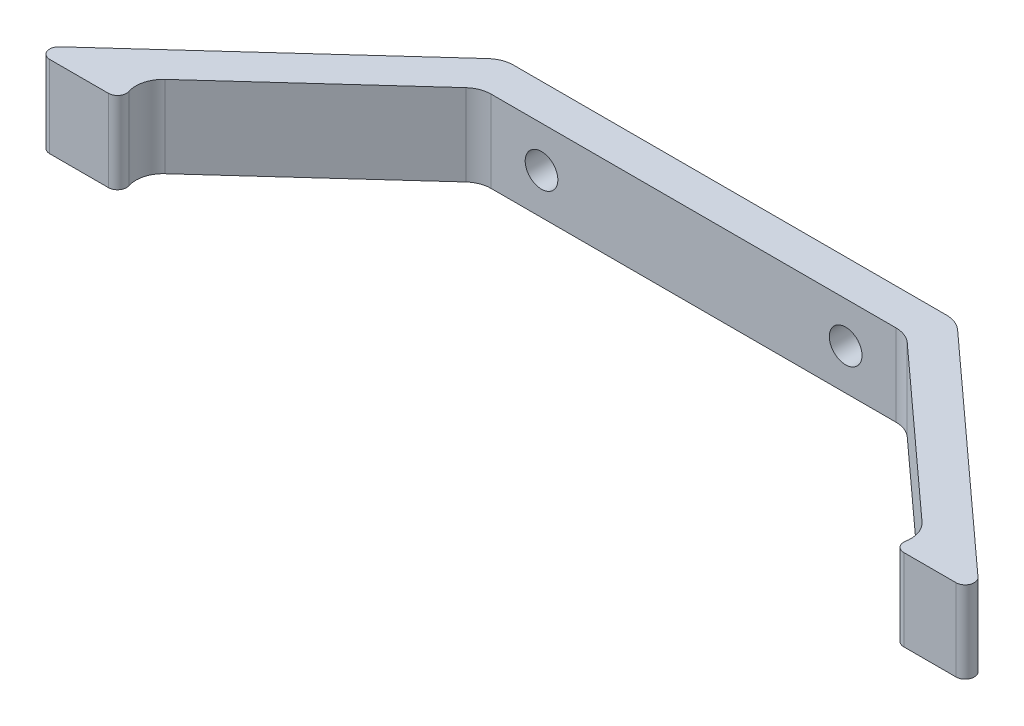
ISO-10303-21;
HEADER;
FILE_DESCRIPTION(('STEP AP214'),'2;1');
FILE_NAME('part.step','',(''),(''),'','','');
FILE_SCHEMA(('AUTOMOTIVE_DESIGN { 1 0 10303 214 1 1 1 1 }'));
ENDSEC;
DATA;
#1=APPLICATION_CONTEXT('core data for automotive mechanical design processes');
#2=APPLICATION_PROTOCOL_DEFINITION('international standard','automotive_design',2000,#1);
#3=PRODUCT_CONTEXT('',#1,'mechanical');
#4=PRODUCT('Part','Part','',(#3));
#5=PRODUCT_RELATED_PRODUCT_CATEGORY('part','',(#4));
#6=PRODUCT_DEFINITION_FORMATION('','',#4);
#7=PRODUCT_DEFINITION_CONTEXT('part definition',#1,'design');
#8=PRODUCT_DEFINITION('design','',#6,#7);
#9=PRODUCT_DEFINITION_SHAPE('','',#8);
#10=(LENGTH_UNIT() NAMED_UNIT(*) SI_UNIT(.MILLI.,.METRE.));
#11=(NAMED_UNIT(*) PLANE_ANGLE_UNIT() SI_UNIT($,.RADIAN.));
#12=(NAMED_UNIT(*) SI_UNIT($,.STERADIAN.) SOLID_ANGLE_UNIT());
#13=UNCERTAINTY_MEASURE_WITH_UNIT(LENGTH_MEASURE(1.E-05),#10,'distance_accuracy_value','');
#14=(GEOMETRIC_REPRESENTATION_CONTEXT(3) GLOBAL_UNCERTAINTY_ASSIGNED_CONTEXT((#13)) GLOBAL_UNIT_ASSIGNED_CONTEXT((#10,
#11,#12)) REPRESENTATION_CONTEXT('',''));
#15=CARTESIAN_POINT('',(0.,0.,0.));
#16=DIRECTION('',(0.,0.,1.));
#17=DIRECTION('',(1.,0.,0.));
#18=AXIS2_PLACEMENT_3D('',#15,#16,#17);
#19=CARTESIAN_POINT('',(25.,9.,-12.5));
#20=DIRECTION('',(0.,0.,1.));
#21=DIRECTION('',(1.,0.,0.));
#22=AXIS2_PLACEMENT_3D('',#19,#20,#21);
#23=PLANE('',#22);
#24=CARTESIAN_POINT('',(-16.75,4.5,-12.5));
#25=DIRECTION('',(0.,0.,1.));
#26=DIRECTION('',(1.,0.,0.));
#27=AXIS2_PLACEMENT_3D('',#24,#25,#26);
#28=CIRCLE('',#27,1.8);
#29=CARTESIAN_POINT('',(-14.95,4.5,-12.5));
#30=VERTEX_POINT('',#29);
#31=EDGE_CURVE('E352',#30,#30,#28,.T.);
#32=ORIENTED_EDGE('',*,*,#31,.T.);
#33=EDGE_LOOP('',(#32));
#34=FACE_BOUND('',#33,.T.);
#35=CARTESIAN_POINT('',(16.75,4.5,-12.5));
#36=DIRECTION('',(0.,0.,1.));
#37=DIRECTION('',(1.,0.,0.));
#38=AXIS2_PLACEMENT_3D('',#35,#36,#37);
#39=CIRCLE('',#38,1.8);
#40=CARTESIAN_POINT('',(18.55,4.5,-12.5));
#41=VERTEX_POINT('',#40);
#42=EDGE_CURVE('E307',#41,#41,#39,.T.);
#43=ORIENTED_EDGE('',*,*,#42,.T.);
#44=EDGE_LOOP('',(#43));
#45=FACE_BOUND('',#44,.T.);
#46=DIRECTION('',(-1.,0.,0.));
#47=VECTOR('',#46,1.);
#48=CARTESIAN_POINT('',(25.,9.,-12.5));
#49=LINE('',#48,#47);
#50=CARTESIAN_POINT('',(23.8401793758045,9.,-12.5));
#51=VERTEX_POINT('',#50);
#52=CARTESIAN_POINT('',(-23.8401793758045,9.,-12.5));
#53=VERTEX_POINT('',#52);
#54=EDGE_CURVE('E186',#51,#53,#49,.T.);
#55=ORIENTED_EDGE('',*,*,#54,.F.);
#56=DIRECTION('',(0.,-1.,0.));
#57=VECTOR('',#56,1.);
#58=CARTESIAN_POINT('',(23.8401793758045,9.,-12.5));
#59=LINE('',#58,#57);
#60=CARTESIAN_POINT('',(23.8401793758045,0.,-12.5));
#61=VERTEX_POINT('',#60);
#62=EDGE_CURVE('E230',#51,#61,#59,.T.);
#63=ORIENTED_EDGE('',*,*,#62,.T.);
#64=DIRECTION('',(-1.,0.,0.));
#65=VECTOR('',#64,1.);
#66=CARTESIAN_POINT('',(25.,0.,-12.5));
#67=LINE('',#66,#65);
#68=CARTESIAN_POINT('',(-23.8401793758045,0.,-12.5));
#69=VERTEX_POINT('',#68);
#70=EDGE_CURVE('E303',#61,#69,#67,.T.);
#71=ORIENTED_EDGE('',*,*,#70,.T.);
#72=DIRECTION('',(0.,-1.,0.));
#73=VECTOR('',#72,1.);
#74=CARTESIAN_POINT('',(-23.8401793758045,9.,-12.5));
#75=LINE('',#74,#73);
#76=EDGE_CURVE('E228',#69,#53,#75,.F.);
#77=ORIENTED_EDGE('',*,*,#76,.T.);
#78=EDGE_LOOP('',(#55,#63,#71,#77));
#79=FACE_BOUND('',#78,.T.);
#80=ADVANCED_FACE('F32',(#34,#45,#79),#23,.F.);
#81=CARTESIAN_POINT('',(-25.,9.,-12.5));
#82=DIRECTION('',(0.672672793996313,0.,0.739940073395943));
#83=DIRECTION('',(0.739940073395944,0.,-0.672672793996313));
#84=AXIS2_PLACEMENT_3D('',#81,#82,#83);
#85=PLANE('',#84);
#86=DIRECTION('',(-0.739940073395944,0.,0.672672793996313));
#87=VECTOR('',#86,1.);
#88=CARTESIAN_POINT('',(-25.,9.,-12.5));
#89=LINE('',#88,#87);
#90=CARTESIAN_POINT('',(-25.8581977577934,9.,-11.7198202201878));
#91=VERTEX_POINT('',#90);
#92=CARTESIAN_POINT('',(-50.5860659192645,9.,10.7600599266041));
#93=VERTEX_POINT('',#92);
#94=EDGE_CURVE('E189',#91,#93,#89,.T.);
#95=ORIENTED_EDGE('',*,*,#94,.F.);
#96=DIRECTION('',(0.,-1.,0.));
#97=VECTOR('',#96,1.);
#98=CARTESIAN_POINT('',(-25.8581977577934,9.,-11.7198202201878));
#99=LINE('',#98,#97);
#100=CARTESIAN_POINT('',(-25.8581977577934,0.,-11.7198202201878));
#101=VERTEX_POINT('',#100);
#102=EDGE_CURVE('E250',#91,#101,#99,.T.);
#103=ORIENTED_EDGE('',*,*,#102,.T.);
#104=DIRECTION('',(-0.739940073395944,0.,0.672672793996313));
#105=VECTOR('',#104,1.);
#106=CARTESIAN_POINT('',(-25.,0.,-12.5));
#107=LINE('',#106,#105);
#108=CARTESIAN_POINT('',(-50.5860659192645,0.,10.7600599266041));
#109=VERTEX_POINT('',#108);
#110=EDGE_CURVE('E306',#101,#109,#107,.T.);
#111=ORIENTED_EDGE('',*,*,#110,.T.);
#112=DIRECTION('',(0.,-1.,0.));
#113=VECTOR('',#112,1.);
#114=CARTESIAN_POINT('',(-50.5860659192644,9.,10.7600599266041));
#115=LINE('',#114,#113);
#116=EDGE_CURVE('E181',#109,#93,#115,.F.);
#117=ORIENTED_EDGE('',*,*,#116,.T.);
#118=EDGE_LOOP('',(#95,#103,#111,#117));
#119=FACE_BOUND('',#118,.T.);
#120=ADVANCED_FACE('F343',(#119),#85,.F.);
#121=CARTESIAN_POINT('',(-52.5,9.,12.5));
#122=DIRECTION('',(0.,0.,-1.));
#123=DIRECTION('',(-1.,0.,0.));
#124=AXIS2_PLACEMENT_3D('',#121,#122,#123);
#125=PLANE('',#124);
#126=DIRECTION('',(1.,0.,0.));
#127=VECTOR('',#126,1.);
#128=CARTESIAN_POINT('',(-52.5,0.,12.5));
#129=LINE('',#128,#127);
#130=CARTESIAN_POINT('',(-49.9133931252681,0.,12.5));
#131=VERTEX_POINT('',#130);
#132=CARTESIAN_POINT('',(-43.454863254184,0.,12.5));
#133=VERTEX_POINT('',#132);
#134=EDGE_CURVE('E309',#131,#133,#129,.T.);
#135=ORIENTED_EDGE('',*,*,#134,.T.);
#136=DIRECTION('',(0.,-1.,0.));
#137=VECTOR('',#136,1.);
#138=CARTESIAN_POINT('',(-43.454863254184,9.,12.5));
#139=LINE('',#138,#137);
#140=CARTESIAN_POINT('',(-43.454863254184,9.,12.5));
#141=VERTEX_POINT('',#140);
#142=EDGE_CURVE('E204',#133,#141,#139,.F.);
#143=ORIENTED_EDGE('',*,*,#142,.T.);
#144=DIRECTION('',(1.,0.,0.));
#145=VECTOR('',#144,1.);
#146=CARTESIAN_POINT('',(-52.5,9.,12.5));
#147=LINE('',#146,#145);
#148=CARTESIAN_POINT('',(-49.9133931252681,9.,12.5));
#149=VERTEX_POINT('',#148);
#150=EDGE_CURVE('E290',#149,#141,#147,.T.);
#151=ORIENTED_EDGE('',*,*,#150,.F.);
#152=DIRECTION('',(0.,-1.,0.));
#153=VECTOR('',#152,1.);
#154=CARTESIAN_POINT('',(-49.9133931252681,9.,12.5));
#155=LINE('',#154,#153);
#156=EDGE_CURVE('E201',#149,#131,#155,.T.);
#157=ORIENTED_EDGE('',*,*,#156,.T.);
#158=EDGE_LOOP('',(#135,#143,#151,#157));
#159=FACE_BOUND('',#158,.T.);
#160=ADVANCED_FACE('F387',(#159),#125,.F.);
#161=CARTESIAN_POINT('',(-43.5019975603943,9.,9.72584096301979));
#162=DIRECTION('',(-0.672672793996313,0.,-0.739940073395944));
#163=DIRECTION('',(-0.739940073395944,0.,0.672672793996313));
#164=AXIS2_PLACEMENT_3D('',#161,#162,#163);
#165=PLANE('',#164);
#166=DIRECTION('',(0.739940073395944,0.,-0.672672793996313));
#167=VECTOR('',#166,1.);
#168=CARTESIAN_POINT('',(-43.5019975603943,0.,9.72584096301979));
#169=LINE('',#168,#167);
#170=CARTESIAN_POINT('',(-41.664894601202,0.,8.05574736375406));
#171=VERTEX_POINT('',#170);
#172=CARTESIAN_POINT('',(-24.311770258866,0.,-7.71982022018782));
#173=VERTEX_POINT('',#172);
#174=EDGE_CURVE('E271',#171,#173,#169,.T.);
#175=ORIENTED_EDGE('',*,*,#174,.T.);
#176=DIRECTION('',(0.,-1.,0.));
#177=VECTOR('',#176,1.);
#178=CARTESIAN_POINT('',(-24.311770258866,9.,-7.71982022018782));
#179=LINE('',#178,#177);
#180=CARTESIAN_POINT('',(-24.311770258866,9.,-7.71982022018782));
#181=VERTEX_POINT('',#180);
#182=EDGE_CURVE('E248',#173,#181,#179,.F.);
#183=ORIENTED_EDGE('',*,*,#182,.T.);
#184=DIRECTION('',(0.739940073395944,0.,-0.672672793996313));
#185=VECTOR('',#184,1.);
#186=CARTESIAN_POINT('',(-43.5019975603943,9.,9.72584096301979));
#187=LINE('',#186,#185);
#188=CARTESIAN_POINT('',(-41.664894601202,9.,8.05574736375406));
#189=VERTEX_POINT('',#188);
#190=EDGE_CURVE('E283',#189,#181,#187,.T.);
#191=ORIENTED_EDGE('',*,*,#190,.F.);
#192=DIRECTION('',(0.,-1.,0.));
#193=VECTOR('',#192,1.);
#194=CARTESIAN_POINT('',(-41.664894601202,9.,8.05574736375406));
#195=LINE('',#194,#193);
#196=EDGE_CURVE('E245',#189,#171,#195,.T.);
#197=ORIENTED_EDGE('',*,*,#196,.T.);
#198=EDGE_LOOP('',(#175,#183,#191,#197));
#199=FACE_BOUND('',#198,.T.);
#200=ADVANCED_FACE('F287',(#199),#165,.F.);
#201=CARTESIAN_POINT('',(-23.4535725010726,9.,-8.49999999999998));
#202=DIRECTION('',(0.,0.,-1.));
#203=DIRECTION('',(-1.,0.,0.));
#204=AXIS2_PLACEMENT_3D('',#201,#202,#203);
#205=PLANE('',#204);
#206=CARTESIAN_POINT('',(-16.75,4.5,-8.49999999999998));
#207=DIRECTION('',(0.,0.,1.));
#208=DIRECTION('',(1.,0.,0.));
#209=AXIS2_PLACEMENT_3D('',#206,#207,#208);
#210=CIRCLE('',#209,1.79999999999999);
#211=CARTESIAN_POINT('',(-14.95,4.5,-8.49999999999998));
#212=VERTEX_POINT('',#211);
#213=EDGE_CURVE('E355',#212,#212,#210,.T.);
#214=ORIENTED_EDGE('',*,*,#213,.F.);
#215=EDGE_LOOP('',(#214));
#216=FACE_BOUND('',#215,.T.);
#217=CARTESIAN_POINT('',(16.75,4.5,-8.49999999999998));
#218=DIRECTION('',(0.,0.,1.));
#219=DIRECTION('',(1.,0.,0.));
#220=AXIS2_PLACEMENT_3D('',#217,#218,#219);
#221=CIRCLE('',#220,1.79999999999999);
#222=CARTESIAN_POINT('',(18.55,4.5,-8.49999999999998));
#223=VERTEX_POINT('',#222);
#224=EDGE_CURVE('E349',#223,#223,#221,.T.);
#225=ORIENTED_EDGE('',*,*,#224,.F.);
#226=EDGE_LOOP('',(#225));
#227=FACE_BOUND('',#226,.T.);
#228=DIRECTION('',(1.,0.,0.));
#229=VECTOR('',#228,1.);
#230=CARTESIAN_POINT('',(-23.4535725010726,0.,-8.49999999999998));
#231=LINE('',#230,#229);
#232=CARTESIAN_POINT('',(-22.293751876877,0.,-8.49999999999998));
#233=VERTEX_POINT('',#232);
#234=CARTESIAN_POINT('',(22.293751876877,0.,-8.49999999999998));
#235=VERTEX_POINT('',#234);
#236=EDGE_CURVE('E312',#233,#235,#231,.T.);
#237=ORIENTED_EDGE('',*,*,#236,.T.);
#238=DIRECTION('',(0.,-1.,0.));
#239=VECTOR('',#238,1.);
#240=CARTESIAN_POINT('',(22.293751876877,9.,-8.49999999999998));
#241=LINE('',#240,#239);
#242=CARTESIAN_POINT('',(22.293751876877,9.,-8.49999999999998));
#243=VERTEX_POINT('',#242);
#244=EDGE_CURVE('E55',#235,#243,#241,.F.);
#245=ORIENTED_EDGE('',*,*,#244,.T.);
#246=DIRECTION('',(1.,0.,0.));
#247=VECTOR('',#246,1.);
#248=CARTESIAN_POINT('',(-23.4535725010726,9.,-8.49999999999998));
#249=LINE('',#248,#247);
#250=CARTESIAN_POINT('',(-22.293751876877,9.,-8.49999999999998));
#251=VERTEX_POINT('',#250);
#252=EDGE_CURVE('E289',#251,#243,#249,.T.);
#253=ORIENTED_EDGE('',*,*,#252,.F.);
#254=DIRECTION('',(0.,-1.,0.));
#255=VECTOR('',#254,1.);
#256=CARTESIAN_POINT('',(-22.293751876877,0.,-8.49999999999998));
#257=LINE('',#256,#255);
#258=EDGE_CURVE('E241',#251,#233,#257,.T.);
#259=ORIENTED_EDGE('',*,*,#258,.T.);
#260=EDGE_LOOP('',(#237,#245,#253,#259));
#261=FACE_BOUND('',#260,.T.);
#262=ADVANCED_FACE('F361',(#216,#227,#261),#205,.F.);
#263=CARTESIAN_POINT('',(23.4535725010726,9.,-8.49999999999998));
#264=DIRECTION('',(0.672672793996312,0.,-0.739940073395944));
#265=DIRECTION('',(-0.739940073395944,0.,-0.672672793996312));
#266=AXIS2_PLACEMENT_3D('',#263,#264,#265);
#267=PLANE('',#266);
#268=DIRECTION('',(0.739940073395944,0.,0.672672793996312));
#269=VECTOR('',#268,1.);
#270=CARTESIAN_POINT('',(23.4535725010726,0.,-8.49999999999998));
#271=LINE('',#270,#269);
#272=CARTESIAN_POINT('',(24.311770258866,0.,-7.71982022018782));
#273=VERTEX_POINT('',#272);
#274=CARTESIAN_POINT('',(42.2362375395269,0.,8.57515003495843));
#275=VERTEX_POINT('',#274);
#276=EDGE_CURVE('E191',#273,#275,#271,.T.);
#277=ORIENTED_EDGE('',*,*,#276,.T.);
#278=DIRECTION('',(0.,-1.,0.));
#279=VECTOR('',#278,1.);
#280=CARTESIAN_POINT('',(42.2362375395269,9.,8.57515003495844));
#281=LINE('',#280,#279);
#282=CARTESIAN_POINT('',(42.2362375395269,9.,8.57515003495843));
#283=VERTEX_POINT('',#282);
#284=EDGE_CURVE('E226',#275,#283,#281,.F.);
#285=ORIENTED_EDGE('',*,*,#284,.T.);
#286=DIRECTION('',(0.739940073395944,0.,0.672672793996312));
#287=VECTOR('',#286,1.);
#288=CARTESIAN_POINT('',(23.4535725010726,9.,-8.49999999999998));
#289=LINE('',#288,#287);
#290=CARTESIAN_POINT('',(24.311770258866,9.,-7.71982022018782));
#291=VERTEX_POINT('',#290);
#292=EDGE_CURVE('E292',#291,#283,#289,.T.);
#293=ORIENTED_EDGE('',*,*,#292,.F.);
#294=DIRECTION('',(0.,-1.,0.));
#295=VECTOR('',#294,1.);
#296=CARTESIAN_POINT('',(24.311770258866,0.,-7.71982022018782));
#297=LINE('',#296,#295);
#298=EDGE_CURVE('E223',#291,#273,#297,.T.);
#299=ORIENTED_EDGE('',*,*,#298,.T.);
#300=EDGE_LOOP('',(#277,#285,#293,#299));
#301=FACE_BOUND('',#300,.T.);
#302=ADVANCED_FACE('F317',(#301),#267,.F.);
#303=CARTESIAN_POINT('',(41.5,9.,12.5));
#304=DIRECTION('',(0.,0.,-1.));
#305=DIRECTION('',(-1.,0.,0.));
#306=AXIS2_PLACEMENT_3D('',#303,#304,#305);
#307=PLANE('',#306);
#308=DIRECTION('',(1.,0.,0.));
#309=VECTOR('',#308,1.);
#310=CARTESIAN_POINT('',(41.5,0.,12.5));
#311=LINE('',#310,#309);
#312=CARTESIAN_POINT('',(44.1555955757727,0.,12.5));
#313=VERTEX_POINT('',#312);
#314=CARTESIAN_POINT('',(49.9133931252682,0.,12.5));
#315=VERTEX_POINT('',#314);
#316=EDGE_CURVE('E187',#313,#315,#311,.T.);
#317=ORIENTED_EDGE('',*,*,#316,.T.);
#318=DIRECTION('',(0.,-1.,0.));
#319=VECTOR('',#318,1.);
#320=CARTESIAN_POINT('',(49.9133931252682,9.,12.5));
#321=LINE('',#320,#319);
#322=CARTESIAN_POINT('',(49.9133931252682,9.,12.5));
#323=VERTEX_POINT('',#322);
#324=EDGE_CURVE('E164',#315,#323,#321,.F.);
#325=ORIENTED_EDGE('',*,*,#324,.T.);
#326=DIRECTION('',(1.,0.,0.));
#327=VECTOR('',#326,1.);
#328=CARTESIAN_POINT('',(41.5,9.,12.5));
#329=LINE('',#328,#327);
#330=CARTESIAN_POINT('',(44.1555955757727,9.,12.5));
#331=VERTEX_POINT('',#330);
#332=EDGE_CURVE('E299',#331,#323,#329,.T.);
#333=ORIENTED_EDGE('',*,*,#332,.F.);
#334=DIRECTION('',(0.,-1.,0.));
#335=VECTOR('',#334,1.);
#336=CARTESIAN_POINT('',(44.1555955757727,9.,12.5));
#337=LINE('',#336,#335);
#338=EDGE_CURVE('E180',#331,#313,#337,.T.);
#339=ORIENTED_EDGE('',*,*,#338,.T.);
#340=EDGE_LOOP('',(#317,#325,#333,#339));
#341=FACE_BOUND('',#340,.T.);
#342=ADVANCED_FACE('F330',(#341),#307,.F.);
#343=CARTESIAN_POINT('',(52.5,9.,12.5));
#344=DIRECTION('',(-0.672672793996312,0.,0.739940073395944));
#345=DIRECTION('',(0.739940073395944,0.,0.672672793996312));
#346=AXIS2_PLACEMENT_3D('',#343,#344,#345);
#347=PLANE('',#346);
#348=DIRECTION('',(-0.739940073395944,0.,-0.672672793996312));
#349=VECTOR('',#348,1.);
#350=CARTESIAN_POINT('',(52.5,0.,12.5));
#351=LINE('',#350,#349);
#352=CARTESIAN_POINT('',(50.5860659192645,0.,10.7600599266041));
#353=VERTEX_POINT('',#352);
#354=CARTESIAN_POINT('',(25.8581977577934,0.,-11.7198202201878));
#355=VERTEX_POINT('',#354);
#356=EDGE_CURVE('E176',#353,#355,#351,.T.);
#357=ORIENTED_EDGE('',*,*,#356,.T.);
#358=DIRECTION('',(0.,-1.,0.));
#359=VECTOR('',#358,1.);
#360=CARTESIAN_POINT('',(25.8581977577934,9.,-11.7198202201878));
#361=LINE('',#360,#359);
#362=CARTESIAN_POINT('',(25.8581977577934,9.,-11.7198202201878));
#363=VERTEX_POINT('',#362);
#364=EDGE_CURVE('E236',#355,#363,#361,.F.);
#365=ORIENTED_EDGE('',*,*,#364,.T.);
#366=DIRECTION('',(-0.739940073395944,0.,-0.672672793996312));
#367=VECTOR('',#366,1.);
#368=CARTESIAN_POINT('',(52.5,9.,12.5));
#369=LINE('',#368,#367);
#370=CARTESIAN_POINT('',(50.5860659192645,9.,10.7600599266041));
#371=VERTEX_POINT('',#370);
#372=EDGE_CURVE('E179',#371,#363,#369,.T.);
#373=ORIENTED_EDGE('',*,*,#372,.F.);
#374=DIRECTION('',(0.,-1.,0.));
#375=VECTOR('',#374,1.);
#376=CARTESIAN_POINT('',(50.5860659192645,9.,10.7600599266041));
#377=LINE('',#376,#375);
#378=EDGE_CURVE('E163',#371,#353,#377,.T.);
#379=ORIENTED_EDGE('',*,*,#378,.T.);
#380=EDGE_LOOP('',(#357,#365,#373,#379));
#381=FACE_BOUND('',#380,.T.);
#382=ADVANCED_FACE('F175',(#381),#347,.F.);
#383=CARTESIAN_POINT('',(0.,9.,0.));
#384=DIRECTION('',(0.,-1.,0.));
#385=DIRECTION('',(0.,0.,-1.));
#386=AXIS2_PLACEMENT_3D('',#383,#384,#385);
#387=PLANE('',#386);
#388=ORIENTED_EDGE('',*,*,#372,.T.);
#389=CARTESIAN_POINT('',(23.8401793758045,9.,-9.49999999999999));
#390=DIRECTION('',(0.,-1.,0.));
#391=DIRECTION('',(0.,0.,-1.));
#392=AXIS2_PLACEMENT_3D('',#389,#390,#391);
#393=CIRCLE('',#392,3.);
#394=EDGE_CURVE('E239',#363,#51,#393,.F.);
#395=ORIENTED_EDGE('',*,*,#394,.T.);
#396=ORIENTED_EDGE('',*,*,#54,.T.);
#397=CARTESIAN_POINT('',(-23.8401793758045,9.,-9.49999999999999));
#398=DIRECTION('',(0.,-1.,0.));
#399=DIRECTION('',(0.,0.,-1.));
#400=AXIS2_PLACEMENT_3D('',#397,#398,#399);
#401=CIRCLE('',#400,3.);
#402=EDGE_CURVE('E47',#53,#91,#401,.F.);
#403=ORIENTED_EDGE('',*,*,#402,.T.);
#404=ORIENTED_EDGE('',*,*,#94,.T.);
#405=CARTESIAN_POINT('',(-49.9133931252681,9.,11.5));
#406=DIRECTION('',(0.,-1.,0.));
#407=DIRECTION('',(0.,0.,-1.));
#408=AXIS2_PLACEMENT_3D('',#405,#406,#407);
#409=CIRCLE('',#408,1.);
#410=EDGE_CURVE('E210',#93,#149,#409,.F.);
#411=ORIENTED_EDGE('',*,*,#410,.T.);
#412=ORIENTED_EDGE('',*,*,#150,.T.);
#413=CARTESIAN_POINT('',(-43.454863254184,9.,11.5));
#414=DIRECTION('',(0.,-1.,0.));
#415=DIRECTION('',(0.,0.,-1.));
#416=AXIS2_PLACEMENT_3D('',#413,#414,#415);
#417=CIRCLE('',#416,1.);
#418=CARTESIAN_POINT('',(-42.5028664954412,9.,11.1938918959855));
#419=VERTEX_POINT('',#418);
#420=EDGE_CURVE('E212',#141,#419,#417,.F.);
#421=ORIENTED_EDGE('',*,*,#420,.T.);
#422=CARTESIAN_POINT('',(-39.6468762192131,9.,10.2755675839419));
#423=DIRECTION('',(0.,-1.,0.));
#424=DIRECTION('',(0.,0.,-1.));
#425=AXIS2_PLACEMENT_3D('',#422,#423,#424);
#426=CIRCLE('',#425,3.);
#427=EDGE_CURVE('E11',#419,#189,#426,.T.);
#428=ORIENTED_EDGE('',*,*,#427,.T.);
#429=ORIENTED_EDGE('',*,*,#190,.T.);
#430=CARTESIAN_POINT('',(-22.293751876877,9.,-5.49999999999998));
#431=DIRECTION('',(0.,-1.,0.));
#432=DIRECTION('',(0.,0.,-1.));
#433=AXIS2_PLACEMENT_3D('',#430,#431,#432);
#434=CIRCLE('',#433,3.);
#435=EDGE_CURVE('E265',#181,#251,#434,.T.);
#436=ORIENTED_EDGE('',*,*,#435,.T.);
#437=ORIENTED_EDGE('',*,*,#252,.T.);
#438=CARTESIAN_POINT('',(22.293751876877,9.,-5.49999999999998));
#439=DIRECTION('',(0.,-1.,0.));
#440=DIRECTION('',(0.,0.,-1.));
#441=AXIS2_PLACEMENT_3D('',#438,#439,#440);
#442=CIRCLE('',#441,3.);
#443=EDGE_CURVE('E261',#243,#291,#442,.T.);
#444=ORIENTED_EDGE('',*,*,#443,.T.);
#445=ORIENTED_EDGE('',*,*,#292,.T.);
#446=CARTESIAN_POINT('',(40.2182191575379,9.,10.7949702551463));
#447=DIRECTION('',(0.,-1.,0.));
#448=DIRECTION('',(0.,0.,-1.));
#449=AXIS2_PLACEMENT_3D('',#446,#447,#448);
#450=CIRCLE('',#449,3.);
#451=CARTESIAN_POINT('',(43.171251471214,9.,11.3237425637866));
#452=VERTEX_POINT('',#451);
#453=EDGE_CURVE('E257',#283,#452,#450,.T.);
#454=ORIENTED_EDGE('',*,*,#453,.T.);
#455=CARTESIAN_POINT('',(44.1555955757727,9.,11.5));
#456=DIRECTION('',(0.,-1.,0.));
#457=DIRECTION('',(0.,0.,-1.));
#458=AXIS2_PLACEMENT_3D('',#455,#456,#457);
#459=CIRCLE('',#458,1.);
#460=EDGE_CURVE('E206',#452,#331,#459,.F.);
#461=ORIENTED_EDGE('',*,*,#460,.T.);
#462=ORIENTED_EDGE('',*,*,#332,.T.);
#463=CARTESIAN_POINT('',(49.9133931252682,9.,11.5));
#464=DIRECTION('',(0.,-1.,0.));
#465=DIRECTION('',(0.,0.,-1.));
#466=AXIS2_PLACEMENT_3D('',#463,#464,#465);
#467=CIRCLE('',#466,1.);
#468=EDGE_CURVE('E208',#323,#371,#467,.F.);
#469=ORIENTED_EDGE('',*,*,#468,.T.);
#470=EDGE_LOOP('',(#388,#395,#396,#403,#404,#411,#412,#421,#428,#429,#436,#437,#444,#445,#454,
#461,#462,#469));
#471=FACE_BOUND('',#470,.T.);
#472=ADVANCED_FACE('F282',(#471),#387,.F.);
#473=CARTESIAN_POINT('',(0.,0.,0.));
#474=DIRECTION('',(0.,-1.,0.));
#475=DIRECTION('',(0.,0.,-1.));
#476=AXIS2_PLACEMENT_3D('',#473,#474,#475);
#477=PLANE('',#476);
#478=ORIENTED_EDGE('',*,*,#70,.F.);
#479=CARTESIAN_POINT('',(23.8401793758045,0.,-9.49999999999999));
#480=DIRECTION('',(0.,-1.,0.));
#481=DIRECTION('',(0.,0.,-1.));
#482=AXIS2_PLACEMENT_3D('',#479,#480,#481);
#483=CIRCLE('',#482,3.);
#484=EDGE_CURVE('E185',#61,#355,#483,.T.);
#485=ORIENTED_EDGE('',*,*,#484,.T.);
#486=ORIENTED_EDGE('',*,*,#356,.F.);
#487=CARTESIAN_POINT('',(49.9133931252682,0.,11.5));
#488=DIRECTION('',(0.,-1.,0.));
#489=DIRECTION('',(0.,0.,-1.));
#490=AXIS2_PLACEMENT_3D('',#487,#488,#489);
#491=CIRCLE('',#490,1.);
#492=EDGE_CURVE('E159',#353,#315,#491,.T.);
#493=ORIENTED_EDGE('',*,*,#492,.T.);
#494=ORIENTED_EDGE('',*,*,#316,.F.);
#495=CARTESIAN_POINT('',(44.1555955757727,0.,11.5));
#496=DIRECTION('',(0.,-1.,0.));
#497=DIRECTION('',(0.,0.,-1.));
#498=AXIS2_PLACEMENT_3D('',#495,#496,#497);
#499=CIRCLE('',#498,1.);
#500=CARTESIAN_POINT('',(43.171251471214,0.,11.3237425637866));
#501=VERTEX_POINT('',#500);
#502=EDGE_CURVE('E170',#313,#501,#499,.T.);
#503=ORIENTED_EDGE('',*,*,#502,.T.);
#504=CARTESIAN_POINT('',(40.2182191575379,0.,10.7949702551463));
#505=DIRECTION('',(0.,-1.,0.));
#506=DIRECTION('',(0.,0.,-1.));
#507=AXIS2_PLACEMENT_3D('',#504,#505,#506);
#508=CIRCLE('',#507,3.);
#509=EDGE_CURVE('E255',#501,#275,#508,.F.);
#510=ORIENTED_EDGE('',*,*,#509,.T.);
#511=ORIENTED_EDGE('',*,*,#276,.F.);
#512=CARTESIAN_POINT('',(22.293751876877,0.,-5.49999999999998));
#513=DIRECTION('',(0.,-1.,0.));
#514=DIRECTION('',(0.,0.,-1.));
#515=AXIS2_PLACEMENT_3D('',#512,#513,#514);
#516=CIRCLE('',#515,3.);
#517=EDGE_CURVE('E259',#273,#235,#516,.F.);
#518=ORIENTED_EDGE('',*,*,#517,.T.);
#519=ORIENTED_EDGE('',*,*,#236,.F.);
#520=CARTESIAN_POINT('',(-22.293751876877,0.,-5.49999999999998));
#521=DIRECTION('',(0.,-1.,0.));
#522=DIRECTION('',(0.,0.,-1.));
#523=AXIS2_PLACEMENT_3D('',#520,#521,#522);
#524=CIRCLE('',#523,3.);
#525=EDGE_CURVE('E263',#233,#173,#524,.F.);
#526=ORIENTED_EDGE('',*,*,#525,.T.);
#527=ORIENTED_EDGE('',*,*,#174,.F.);
#528=CARTESIAN_POINT('',(-39.6468762192131,0.,10.2755675839419));
#529=DIRECTION('',(0.,-1.,0.));
#530=DIRECTION('',(0.,0.,-1.));
#531=AXIS2_PLACEMENT_3D('',#528,#529,#530);
#532=CIRCLE('',#531,3.);
#533=CARTESIAN_POINT('',(-42.5028664954412,0.,11.1938918959855));
#534=VERTEX_POINT('',#533);
#535=EDGE_CURVE('E40',#171,#534,#532,.F.);
#536=ORIENTED_EDGE('',*,*,#535,.T.);
#537=CARTESIAN_POINT('',(-43.454863254184,0.,11.5));
#538=DIRECTION('',(0.,-1.,0.));
#539=DIRECTION('',(0.,0.,-1.));
#540=AXIS2_PLACEMENT_3D('',#537,#538,#539);
#541=CIRCLE('',#540,1.);
#542=EDGE_CURVE('E199',#534,#133,#541,.T.);
#543=ORIENTED_EDGE('',*,*,#542,.T.);
#544=ORIENTED_EDGE('',*,*,#134,.F.);
#545=CARTESIAN_POINT('',(-49.9133931252681,0.,11.5));
#546=DIRECTION('',(0.,-1.,0.));
#547=DIRECTION('',(0.,0.,-1.));
#548=AXIS2_PLACEMENT_3D('',#545,#546,#547);
#549=CIRCLE('',#548,1.);
#550=EDGE_CURVE('E169',#131,#109,#549,.T.);
#551=ORIENTED_EDGE('',*,*,#550,.T.);
#552=ORIENTED_EDGE('',*,*,#110,.F.);
#553=CARTESIAN_POINT('',(-23.8401793758045,0.,-9.49999999999999));
#554=DIRECTION('',(0.,-1.,0.));
#555=DIRECTION('',(0.,0.,-1.));
#556=AXIS2_PLACEMENT_3D('',#553,#554,#555);
#557=CIRCLE('',#556,3.);
#558=EDGE_CURVE('E233',#101,#69,#557,.T.);
#559=ORIENTED_EDGE('',*,*,#558,.T.);
#560=EDGE_LOOP('',(#478,#485,#486,#493,#494,#503,#510,#511,#518,#519,#526,#527,#536,#543,#544,
#551,#552,#559));
#561=FACE_BOUND('',#560,.T.);
#562=ADVANCED_FACE('F184',(#561),#477,.T.);
#563=CARTESIAN_POINT('',(-43.454863254184,9.,11.5));
#564=DIRECTION('',(0.,-1.,0.));
#565=DIRECTION('',(0.,0.,-1.));
#566=AXIS2_PLACEMENT_3D('',#563,#564,#565);
#567=CYLINDRICAL_SURFACE('',#566,1.);
#568=ORIENTED_EDGE('',*,*,#542,.F.);
#569=DIRECTION('',(0.,-1.,0.));
#570=VECTOR('',#569,1.);
#571=CARTESIAN_POINT('',(-42.5028664954412,9.,11.1938918959855));
#572=LINE('',#571,#570);
#573=EDGE_CURVE('E253',#534,#419,#572,.F.);
#574=ORIENTED_EDGE('',*,*,#573,.T.);
#575=ORIENTED_EDGE('',*,*,#420,.F.);
#576=ORIENTED_EDGE('',*,*,#142,.F.);
#577=EDGE_LOOP('',(#568,#574,#575,#576));
#578=FACE_BOUND('',#577,.T.);
#579=ADVANCED_FACE('F277',(#578),#567,.T.);
#580=CARTESIAN_POINT('',(-49.9133931252681,9.,11.5));
#581=DIRECTION('',(0.,-1.,0.));
#582=DIRECTION('',(0.,0.,-1.));
#583=AXIS2_PLACEMENT_3D('',#580,#581,#582);
#584=CYLINDRICAL_SURFACE('',#583,1.);
#585=ORIENTED_EDGE('',*,*,#410,.F.);
#586=ORIENTED_EDGE('',*,*,#116,.F.);
#587=ORIENTED_EDGE('',*,*,#550,.F.);
#588=ORIENTED_EDGE('',*,*,#156,.F.);
#589=EDGE_LOOP('',(#585,#586,#587,#588));
#590=FACE_BOUND('',#589,.T.);
#591=ADVANCED_FACE('F394',(#590),#584,.T.);
#592=CARTESIAN_POINT('',(49.9133931252682,9.,11.5));
#593=DIRECTION('',(0.,-1.,0.));
#594=DIRECTION('',(0.,0.,-1.));
#595=AXIS2_PLACEMENT_3D('',#592,#593,#594);
#596=CYLINDRICAL_SURFACE('',#595,1.);
#597=ORIENTED_EDGE('',*,*,#468,.F.);
#598=ORIENTED_EDGE('',*,*,#324,.F.);
#599=ORIENTED_EDGE('',*,*,#492,.F.);
#600=ORIENTED_EDGE('',*,*,#378,.F.);
#601=EDGE_LOOP('',(#597,#598,#599,#600));
#602=FACE_BOUND('',#601,.T.);
#603=ADVANCED_FACE('F162',(#602),#596,.T.);
#604=CARTESIAN_POINT('',(44.1555955757727,9.,11.5));
#605=DIRECTION('',(0.,-1.,0.));
#606=DIRECTION('',(0.,0.,-1.));
#607=AXIS2_PLACEMENT_3D('',#604,#605,#606);
#608=CYLINDRICAL_SURFACE('',#607,1.);
#609=ORIENTED_EDGE('',*,*,#460,.F.);
#610=DIRECTION('',(0.,-1.,0.));
#611=VECTOR('',#610,1.);
#612=CARTESIAN_POINT('',(43.171251471214,9.,11.3237425637866));
#613=LINE('',#612,#611);
#614=EDGE_CURVE('E220',#452,#501,#613,.T.);
#615=ORIENTED_EDGE('',*,*,#614,.T.);
#616=ORIENTED_EDGE('',*,*,#502,.F.);
#617=ORIENTED_EDGE('',*,*,#338,.F.);
#618=EDGE_LOOP('',(#609,#615,#616,#617));
#619=FACE_BOUND('',#618,.T.);
#620=ADVANCED_FACE('F328',(#619),#608,.T.);
#621=CARTESIAN_POINT('',(40.2182191575379,9.,10.7949702551463));
#622=DIRECTION('',(0.,-1.,0.));
#623=DIRECTION('',(0.,0.,-1.));
#624=AXIS2_PLACEMENT_3D('',#621,#622,#623);
#625=CYLINDRICAL_SURFACE('',#624,3.);
#626=ORIENTED_EDGE('',*,*,#453,.F.);
#627=ORIENTED_EDGE('',*,*,#284,.F.);
#628=ORIENTED_EDGE('',*,*,#509,.F.);
#629=ORIENTED_EDGE('',*,*,#614,.F.);
#630=EDGE_LOOP('',(#626,#627,#628,#629));
#631=FACE_BOUND('',#630,.T.);
#632=ADVANCED_FACE('F322',(#631),#625,.F.);
#633=CARTESIAN_POINT('',(23.8401793758045,9.,-9.49999999999999));
#634=DIRECTION('',(0.,-1.,0.));
#635=DIRECTION('',(0.,0.,-1.));
#636=AXIS2_PLACEMENT_3D('',#633,#634,#635);
#637=CYLINDRICAL_SURFACE('',#636,3.);
#638=ORIENTED_EDGE('',*,*,#394,.F.);
#639=ORIENTED_EDGE('',*,*,#364,.F.);
#640=ORIENTED_EDGE('',*,*,#484,.F.);
#641=ORIENTED_EDGE('',*,*,#62,.F.);
#642=EDGE_LOOP('',(#638,#639,#640,#641));
#643=FACE_BOUND('',#642,.T.);
#644=ADVANCED_FACE('F335',(#643),#637,.T.);
#645=CARTESIAN_POINT('',(22.293751876877,9.,-5.49999999999998));
#646=DIRECTION('',(0.,1.,0.));
#647=DIRECTION('',(0.,0.,1.));
#648=AXIS2_PLACEMENT_3D('',#645,#646,#647);
#649=CYLINDRICAL_SURFACE('',#648,3.);
#650=ORIENTED_EDGE('',*,*,#443,.F.);
#651=ORIENTED_EDGE('',*,*,#244,.F.);
#652=ORIENTED_EDGE('',*,*,#517,.F.);
#653=ORIENTED_EDGE('',*,*,#298,.F.);
#654=EDGE_LOOP('',(#650,#651,#652,#653));
#655=FACE_BOUND('',#654,.T.);
#656=ADVANCED_FACE('F370',(#655),#649,.F.);
#657=CARTESIAN_POINT('',(-22.293751876877,9.,-5.49999999999998));
#658=DIRECTION('',(0.,1.,0.));
#659=DIRECTION('',(0.,0.,1.));
#660=AXIS2_PLACEMENT_3D('',#657,#658,#659);
#661=CYLINDRICAL_SURFACE('',#660,3.);
#662=ORIENTED_EDGE('',*,*,#435,.F.);
#663=ORIENTED_EDGE('',*,*,#182,.F.);
#664=ORIENTED_EDGE('',*,*,#525,.F.);
#665=ORIENTED_EDGE('',*,*,#258,.F.);
#666=EDGE_LOOP('',(#662,#663,#664,#665));
#667=FACE_BOUND('',#666,.T.);
#668=ADVANCED_FACE('F372',(#667),#661,.F.);
#669=CARTESIAN_POINT('',(-23.8401793758045,9.,-9.49999999999999));
#670=DIRECTION('',(0.,-1.,0.));
#671=DIRECTION('',(0.,0.,-1.));
#672=AXIS2_PLACEMENT_3D('',#669,#670,#671);
#673=CYLINDRICAL_SURFACE('',#672,3.);
#674=ORIENTED_EDGE('',*,*,#402,.F.);
#675=ORIENTED_EDGE('',*,*,#76,.F.);
#676=ORIENTED_EDGE('',*,*,#558,.F.);
#677=ORIENTED_EDGE('',*,*,#102,.F.);
#678=EDGE_LOOP('',(#674,#675,#676,#677));
#679=FACE_BOUND('',#678,.T.);
#680=ADVANCED_FACE('F341',(#679),#673,.T.);
#681=CARTESIAN_POINT('',(-39.6468762192131,9.,10.2755675839419));
#682=DIRECTION('',(0.,-1.,0.));
#683=DIRECTION('',(0.,0.,-1.));
#684=AXIS2_PLACEMENT_3D('',#681,#682,#683);
#685=CYLINDRICAL_SURFACE('',#684,3.);
#686=ORIENTED_EDGE('',*,*,#427,.F.);
#687=ORIENTED_EDGE('',*,*,#573,.F.);
#688=ORIENTED_EDGE('',*,*,#535,.F.);
#689=ORIENTED_EDGE('',*,*,#196,.F.);
#690=EDGE_LOOP('',(#686,#687,#688,#689));
#691=FACE_BOUND('',#690,.T.);
#692=ADVANCED_FACE('F34',(#691),#685,.F.);
#693=CARTESIAN_POINT('',(16.75,4.5,-8.49999999999998));
#694=DIRECTION('',(0.,0.,1.));
#695=DIRECTION('',(1.,0.,0.));
#696=AXIS2_PLACEMENT_3D('',#693,#694,#695);
#697=CYLINDRICAL_SURFACE('',#696,1.79999999999999);
#698=ORIENTED_EDGE('',*,*,#42,.F.);
#699=EDGE_LOOP('',(#698));
#700=FACE_BOUND('',#699,.T.);
#701=ORIENTED_EDGE('',*,*,#224,.T.);
#702=EDGE_LOOP('',(#701));
#703=FACE_BOUND('',#702,.T.);
#704=ADVANCED_FACE('F430',(#700,#703),#697,.F.);
#705=CARTESIAN_POINT('',(-16.75,4.5,-8.49999999999998));
#706=DIRECTION('',(0.,0.,1.));
#707=DIRECTION('',(1.,0.,0.));
#708=AXIS2_PLACEMENT_3D('',#705,#706,#707);
#709=CYLINDRICAL_SURFACE('',#708,1.79999999999999);
#710=ORIENTED_EDGE('',*,*,#31,.F.);
#711=EDGE_LOOP('',(#710));
#712=FACE_BOUND('',#711,.T.);
#713=ORIENTED_EDGE('',*,*,#213,.T.);
#714=EDGE_LOOP('',(#713));
#715=FACE_BOUND('',#714,.T.);
#716=ADVANCED_FACE('F359',(#712,#715),#709,.F.);
#717=CLOSED_SHELL('',(#80,#120,#160,#200,#262,#302,#342,#382,#472,#562,#579,#591,#603,#620,#632,
#644,#656,#668,#680,#692,#704,#716));
#718=MANIFOLD_SOLID_BREP('B2',#717);
#719=ADVANCED_BREP_SHAPE_REPRESENTATION('',(#18,#718),#14);
#720=SHAPE_DEFINITION_REPRESENTATION(#9,#719);
ENDSEC;
END-ISO-10303-21;
